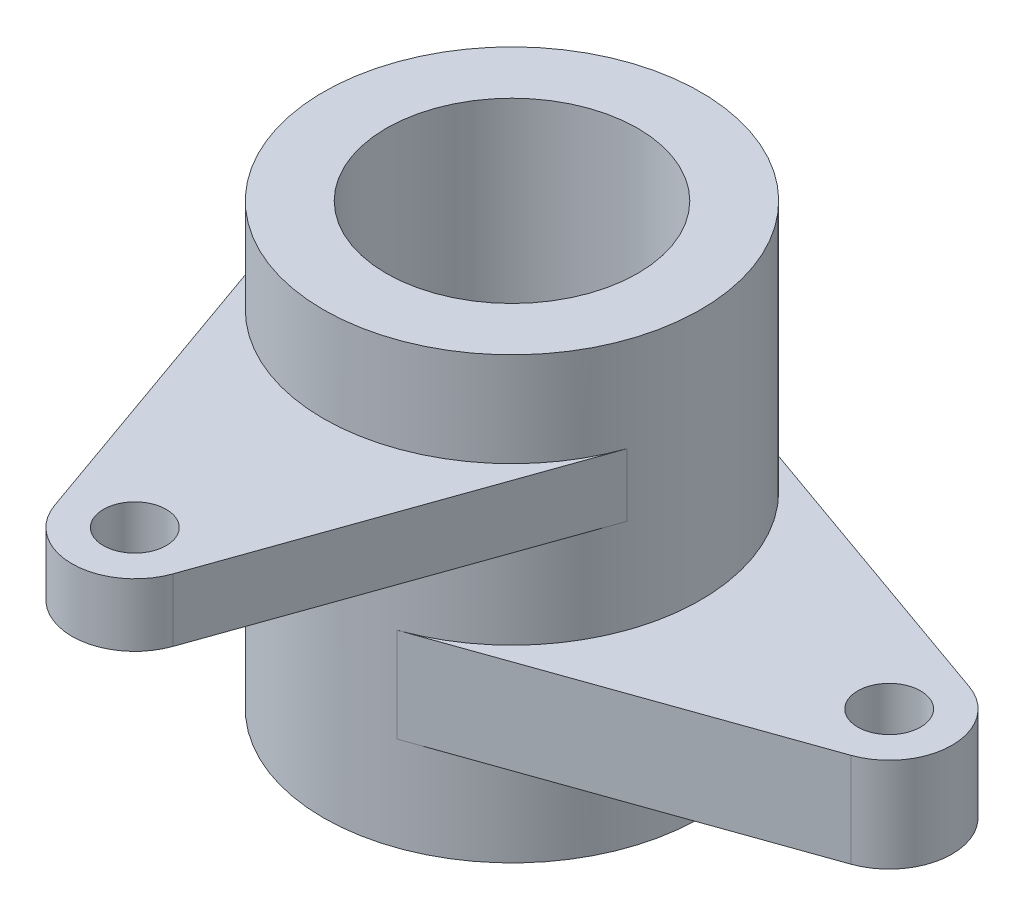
ISO-10303-21;
HEADER;
FILE_DESCRIPTION(('STEP AP214'),'2;1');
FILE_NAME('part.step','',(''),(''),'','','');
FILE_SCHEMA(('AUTOMOTIVE_DESIGN { 1 0 10303 214 1 1 1 1 }'));
ENDSEC;
DATA;
#1=APPLICATION_CONTEXT('core data for automotive mechanical design processes');
#2=APPLICATION_PROTOCOL_DEFINITION('international standard','automotive_design',2000,#1);
#3=PRODUCT_CONTEXT('',#1,'mechanical');
#4=PRODUCT('Part','Part','',(#3));
#5=PRODUCT_RELATED_PRODUCT_CATEGORY('part','',(#4));
#6=PRODUCT_DEFINITION_FORMATION('','',#4);
#7=PRODUCT_DEFINITION_CONTEXT('part definition',#1,'design');
#8=PRODUCT_DEFINITION('design','',#6,#7);
#9=PRODUCT_DEFINITION_SHAPE('','',#8);
#10=(LENGTH_UNIT() NAMED_UNIT(*) SI_UNIT(.MILLI.,.METRE.));
#11=(NAMED_UNIT(*) PLANE_ANGLE_UNIT() SI_UNIT($,.RADIAN.));
#12=(NAMED_UNIT(*) SI_UNIT($,.STERADIAN.) SOLID_ANGLE_UNIT());
#13=UNCERTAINTY_MEASURE_WITH_UNIT(LENGTH_MEASURE(1.E-05),#10,'distance_accuracy_value','');
#14=(GEOMETRIC_REPRESENTATION_CONTEXT(3) GLOBAL_UNCERTAINTY_ASSIGNED_CONTEXT((#13)) GLOBAL_UNIT_ASSIGNED_CONTEXT((#10,
#11,#12)) REPRESENTATION_CONTEXT('',''));
#15=CARTESIAN_POINT('',(0.,0.,0.));
#16=DIRECTION('',(0.,0.,1.));
#17=DIRECTION('',(1.,0.,0.));
#18=AXIS2_PLACEMENT_3D('',#15,#16,#17);
#19=CARTESIAN_POINT('',(10.0000000000001,-55.,28.2842712474619));
#20=DIRECTION('',(0.333333333333337,0.,0.942809041582062));
#21=DIRECTION('',(0.942809041582062,0.,-0.333333333333337));
#22=AXIS2_PLACEMENT_3D('',#19,#20,#21);
#23=PLANE('',#22);
#24=DIRECTION('',(0.942809041582062,0.,-0.333333333333337));
#25=VECTOR('',#24,1.);
#26=CARTESIAN_POINT('',(10.0000000000001,-40.,28.2842712474619));
#27=LINE('',#26,#25);
#28=CARTESIAN_POINT('',(10.0000000000001,-40.,28.2842712474619));
#29=VERTEX_POINT('',#28);
#30=CARTESIAN_POINT('',(63.3333333333333,-40.,9.42809041582041));
#31=VERTEX_POINT('',#30);
#32=EDGE_CURVE('E113',#29,#31,#27,.T.);
#33=ORIENTED_EDGE('',*,*,#32,.F.);
#34=DIRECTION('',(0.,1.,0.));
#35=VECTOR('',#34,1.);
#36=CARTESIAN_POINT('',(10.0000000000001,-55.,28.2842712474619));
#37=LINE('',#36,#35);
#38=CARTESIAN_POINT('',(10.0000000000001,-55.,28.2842712474619));
#39=VERTEX_POINT('',#38);
#40=EDGE_CURVE('E12',#39,#29,#37,.T.);
#41=ORIENTED_EDGE('',*,*,#40,.F.);
#42=DIRECTION('',(0.942809041582062,0.,-0.333333333333337));
#43=VECTOR('',#42,1.);
#44=CARTESIAN_POINT('',(10.0000000000001,-55.,28.2842712474619));
#45=LINE('',#44,#43);
#46=CARTESIAN_POINT('',(63.3333333333333,-55.,9.42809041582041));
#47=VERTEX_POINT('',#46);
#48=EDGE_CURVE('E103',#39,#47,#45,.T.);
#49=ORIENTED_EDGE('',*,*,#48,.T.);
#50=DIRECTION('',(0.,1.,0.));
#51=VECTOR('',#50,1.);
#52=CARTESIAN_POINT('',(63.3333333333333,-55.,9.42809041582041));
#53=LINE('',#52,#51);
#54=EDGE_CURVE('E47',#47,#31,#53,.T.);
#55=ORIENTED_EDGE('',*,*,#54,.T.);
#56=EDGE_LOOP('',(#33,#41,#49,#55));
#57=FACE_BOUND('',#56,.T.);
#58=ADVANCED_FACE('F43',(#57),#23,.T.);
#59=CARTESIAN_POINT('',(0.,-55.,0.));
#60=DIRECTION('',(0.,1.,0.));
#61=DIRECTION('',(1.,0.,0.));
#62=AXIS2_PLACEMENT_3D('',#59,#60,#61);
#63=CYLINDRICAL_SURFACE('',#62,30.);
#64=CARTESIAN_POINT('',(0.,-40.,0.));
#65=DIRECTION('',(0.,1.,0.));
#66=DIRECTION('',(1.,0.,0.));
#67=AXIS2_PLACEMENT_3D('',#64,#65,#66);
#68=CIRCLE('',#67,30.);
#69=CARTESIAN_POINT('',(9.9999999999999,-40.,-28.2842712474619));
#70=VERTEX_POINT('',#69);
#71=EDGE_CURVE('E119',#29,#70,#68,.T.);
#72=ORIENTED_EDGE('',*,*,#71,.T.);
#73=DIRECTION('',(0.,1.,0.));
#74=VECTOR('',#73,1.);
#75=CARTESIAN_POINT('',(9.9999999999999,-55.,-28.2842712474619));
#76=LINE('',#75,#74);
#77=CARTESIAN_POINT('',(9.9999999999999,-55.,-28.2842712474619));
#78=VERTEX_POINT('',#77);
#79=EDGE_CURVE('E53',#78,#70,#76,.T.);
#80=ORIENTED_EDGE('',*,*,#79,.F.);
#81=CARTESIAN_POINT('',(0.,-55.,0.));
#82=DIRECTION('',(0.,1.,0.));
#83=DIRECTION('',(1.,0.,0.));
#84=AXIS2_PLACEMENT_3D('',#81,#82,#83);
#85=CIRCLE('',#84,30.);
#86=EDGE_CURVE('E100',#39,#78,#85,.T.);
#87=ORIENTED_EDGE('',*,*,#86,.F.);
#88=ORIENTED_EDGE('',*,*,#40,.T.);
#89=EDGE_LOOP('',(#72,#80,#87,#88));
#90=FACE_BOUND('',#89,.T.);
#91=ADVANCED_FACE('F134',(#90),#63,.F.);
#92=CARTESIAN_POINT('',(9.9999999999999,-55.,-28.2842712474619));
#93=DIRECTION('',(0.33333333333333,0.,-0.942809041582065));
#94=DIRECTION('',(-0.942809041582065,0.,-0.33333333333333));
#95=AXIS2_PLACEMENT_3D('',#92,#93,#94);
#96=PLANE('',#95);
#97=DIRECTION('',(-0.942809041582065,0.,-0.33333333333333));
#98=VECTOR('',#97,1.);
#99=CARTESIAN_POINT('',(9.9999999999999,-40.,-28.2842712474619));
#100=LINE('',#99,#98);
#101=CARTESIAN_POINT('',(63.3333333333333,-40.,-9.42809041582086));
#102=VERTEX_POINT('',#101);
#103=EDGE_CURVE('E94',#102,#70,#100,.T.);
#104=ORIENTED_EDGE('',*,*,#103,.F.);
#105=DIRECTION('',(0.,1.,0.));
#106=VECTOR('',#105,1.);
#107=CARTESIAN_POINT('',(63.3333333333333,-55.,-9.42809041582086));
#108=LINE('',#107,#106);
#109=CARTESIAN_POINT('',(63.3333333333333,-55.,-9.42809041582086));
#110=VERTEX_POINT('',#109);
#111=EDGE_CURVE('E89',#110,#102,#108,.T.);
#112=ORIENTED_EDGE('',*,*,#111,.F.);
#113=DIRECTION('',(-0.942809041582065,0.,-0.33333333333333));
#114=VECTOR('',#113,1.);
#115=CARTESIAN_POINT('',(9.9999999999999,-55.,-28.2842712474619));
#116=LINE('',#115,#114);
#117=EDGE_CURVE('E92',#110,#78,#116,.T.);
#118=ORIENTED_EDGE('',*,*,#117,.T.);
#119=ORIENTED_EDGE('',*,*,#79,.T.);
#120=EDGE_LOOP('',(#104,#112,#118,#119));
#121=FACE_BOUND('',#120,.T.);
#122=ADVANCED_FACE('F91',(#121),#96,.T.);
#123=CARTESIAN_POINT('',(60.,-55.,-2.16836761125472E-13));
#124=DIRECTION('',(0.,1.,0.));
#125=DIRECTION('',(1.,0.,0.));
#126=AXIS2_PLACEMENT_3D('',#123,#124,#125);
#127=CYLINDRICAL_SURFACE('',#126,5.);
#128=CARTESIAN_POINT('',(60.,-55.,-2.16836761125472E-13));
#129=DIRECTION('',(0.,1.,0.));
#130=DIRECTION('',(1.,0.,0.));
#131=AXIS2_PLACEMENT_3D('',#128,#129,#130);
#132=CIRCLE('',#131,5.);
#133=CARTESIAN_POINT('',(65.,-55.,-2.34294167819688E-13));
#134=VERTEX_POINT('',#133);
#135=EDGE_CURVE('E105',#134,#134,#132,.T.);
#136=ORIENTED_EDGE('',*,*,#135,.F.);
#137=EDGE_LOOP('',(#136));
#138=FACE_BOUND('',#137,.T.);
#139=CARTESIAN_POINT('',(60.,-40.,-2.16836761125472E-13));
#140=DIRECTION('',(0.,1.,0.));
#141=DIRECTION('',(1.,0.,0.));
#142=AXIS2_PLACEMENT_3D('',#139,#140,#141);
#143=CIRCLE('',#142,5.);
#144=CARTESIAN_POINT('',(65.,-40.,-2.34294167819688E-13));
#145=VERTEX_POINT('',#144);
#146=EDGE_CURVE('E110',#145,#145,#143,.T.);
#147=ORIENTED_EDGE('',*,*,#146,.T.);
#148=EDGE_LOOP('',(#147));
#149=FACE_BOUND('',#148,.T.);
#150=ADVANCED_FACE('F45',(#138,#149),#127,.F.);
#151=CARTESIAN_POINT('',(60.,-55.,-2.16836761125472E-13));
#152=DIRECTION('',(0.,1.,0.));
#153=DIRECTION('',(1.,0.,0.));
#154=AXIS2_PLACEMENT_3D('',#151,#152,#153);
#155=CYLINDRICAL_SURFACE('',#154,10.);
#156=CARTESIAN_POINT('',(60.,-40.,-2.16836761125472E-13));
#157=DIRECTION('',(0.,1.,0.));
#158=DIRECTION('',(1.,0.,0.));
#159=AXIS2_PLACEMENT_3D('',#156,#157,#158);
#160=CIRCLE('',#159,10.);
#161=EDGE_CURVE('E116',#31,#102,#160,.T.);
#162=ORIENTED_EDGE('',*,*,#161,.F.);
#163=ORIENTED_EDGE('',*,*,#54,.F.);
#164=CARTESIAN_POINT('',(60.,-55.,-2.16836761125472E-13));
#165=DIRECTION('',(0.,1.,0.));
#166=DIRECTION('',(1.,0.,0.));
#167=AXIS2_PLACEMENT_3D('',#164,#165,#166);
#168=CIRCLE('',#167,10.);
#169=EDGE_CURVE('E99',#47,#110,#168,.T.);
#170=ORIENTED_EDGE('',*,*,#169,.T.);
#171=ORIENTED_EDGE('',*,*,#111,.T.);
#172=EDGE_LOOP('',(#162,#163,#170,#171));
#173=FACE_BOUND('',#172,.T.);
#174=ADVANCED_FACE('F102',(#173),#155,.T.);
#175=CARTESIAN_POINT('',(0.,-55.,0.));
#176=DIRECTION('',(0.,1.,0.));
#177=DIRECTION('',(1.,0.,0.));
#178=AXIS2_PLACEMENT_3D('',#175,#176,#177);
#179=PLANE('',#178);
#180=ORIENTED_EDGE('',*,*,#135,.T.);
#181=EDGE_LOOP('',(#180));
#182=FACE_BOUND('',#181,.T.);
#183=ORIENTED_EDGE('',*,*,#48,.F.);
#184=ORIENTED_EDGE('',*,*,#86,.T.);
#185=ORIENTED_EDGE('',*,*,#117,.F.);
#186=ORIENTED_EDGE('',*,*,#169,.F.);
#187=EDGE_LOOP('',(#183,#184,#185,#186));
#188=FACE_BOUND('',#187,.T.);
#189=ADVANCED_FACE('F98',(#182,#188),#179,.F.);
#190=CARTESIAN_POINT('',(0.,-40.,0.));
#191=DIRECTION('',(0.,1.,0.));
#192=DIRECTION('',(1.,0.,0.));
#193=AXIS2_PLACEMENT_3D('',#190,#191,#192);
#194=PLANE('',#193);
#195=ORIENTED_EDGE('',*,*,#146,.F.);
#196=EDGE_LOOP('',(#195));
#197=FACE_BOUND('',#196,.T.);
#198=ORIENTED_EDGE('',*,*,#32,.T.);
#199=ORIENTED_EDGE('',*,*,#161,.T.);
#200=ORIENTED_EDGE('',*,*,#103,.T.);
#201=ORIENTED_EDGE('',*,*,#71,.F.);
#202=EDGE_LOOP('',(#198,#199,#200,#201));
#203=FACE_BOUND('',#202,.T.);
#204=ADVANCED_FACE('F129',(#197,#203),#194,.T.);
#205=CLOSED_SHELL('',(#58,#91,#122,#150,#174,#189,#204));
#206=MANIFOLD_SOLID_BREP('B2',#205);
#207=CARTESIAN_POINT('',(0.,-70.,0.));
#208=DIRECTION('',(0.,1.,0.));
#209=DIRECTION('',(0.,0.,1.));
#210=AXIS2_PLACEMENT_3D('',#207,#208,#209);
#211=CYLINDRICAL_SURFACE('',#210,30.);
#212=CARTESIAN_POINT('',(0.,-70.,0.));
#213=DIRECTION('',(0.,1.,0.));
#214=DIRECTION('',(0.,0.,1.));
#215=AXIS2_PLACEMENT_3D('',#212,#213,#214);
#216=CIRCLE('',#215,30.);
#217=CARTESIAN_POINT('',(0.,-70.,30.));
#218=VERTEX_POINT('',#217);
#219=EDGE_CURVE('E41',#218,#218,#216,.T.);
#220=ORIENTED_EDGE('',*,*,#219,.T.);
#221=EDGE_LOOP('',(#220));
#222=FACE_BOUND('',#221,.T.);
#223=CARTESIAN_POINT('',(0.,0.,0.));
#224=DIRECTION('',(0.,1.,0.));
#225=DIRECTION('',(0.,0.,1.));
#226=AXIS2_PLACEMENT_3D('',#223,#224,#225);
#227=CIRCLE('',#226,30.);
#228=CARTESIAN_POINT('',(0.,0.,30.));
#229=VERTEX_POINT('',#228);
#230=EDGE_CURVE('E194',#229,#229,#227,.T.);
#231=ORIENTED_EDGE('',*,*,#230,.F.);
#232=EDGE_LOOP('',(#231));
#233=FACE_BOUND('',#232,.T.);
#234=DIRECTION('',(0.,1.,0.));
#235=VECTOR('',#234,1.);
#236=CARTESIAN_POINT('',(28.2842712474619,-25.,10.));
#237=LINE('',#236,#235);
#238=CARTESIAN_POINT('',(28.2842712474619,-25.,10.));
#239=VERTEX_POINT('',#238);
#240=CARTESIAN_POINT('',(28.2842712474619,-15.,10.));
#241=VERTEX_POINT('',#240);
#242=EDGE_CURVE('E210',#239,#241,#237,.T.);
#243=ORIENTED_EDGE('',*,*,#242,.F.);
#244=CARTESIAN_POINT('',(0.,-25.,0.));
#245=DIRECTION('',(0.,1.,0.));
#246=DIRECTION('',(0.,0.,1.));
#247=AXIS2_PLACEMENT_3D('',#244,#245,#246);
#248=CIRCLE('',#247,30.);
#249=CARTESIAN_POINT('',(-28.2842712474619,-25.,10.));
#250=VERTEX_POINT('',#249);
#251=EDGE_CURVE('E205',#250,#239,#248,.T.);
#252=ORIENTED_EDGE('',*,*,#251,.F.);
#253=DIRECTION('',(0.,1.,0.));
#254=VECTOR('',#253,1.);
#255=CARTESIAN_POINT('',(-28.2842712474619,-25.,10.));
#256=LINE('',#255,#254);
#257=CARTESIAN_POINT('',(-28.2842712474619,-15.,10.));
#258=VERTEX_POINT('',#257);
#259=EDGE_CURVE('E250',#250,#258,#256,.T.);
#260=ORIENTED_EDGE('',*,*,#259,.T.);
#261=CARTESIAN_POINT('',(0.,-15.,0.));
#262=DIRECTION('',(0.,1.,0.));
#263=DIRECTION('',(0.,0.,1.));
#264=AXIS2_PLACEMENT_3D('',#261,#262,#263);
#265=CIRCLE('',#264,30.);
#266=EDGE_CURVE('E254',#258,#241,#265,.T.);
#267=ORIENTED_EDGE('',*,*,#266,.T.);
#268=EDGE_LOOP('',(#243,#252,#260,#267));
#269=FACE_BOUND('',#268,.T.);
#270=ADVANCED_FACE('F191',(#222,#233,#269),#211,.T.);
#271=CARTESIAN_POINT('',(0.,-70.,0.));
#272=DIRECTION('',(0.,1.,0.));
#273=DIRECTION('',(0.,0.,1.));
#274=AXIS2_PLACEMENT_3D('',#271,#272,#273);
#275=PLANE('',#274);
#276=CARTESIAN_POINT('',(0.,-70.,0.));
#277=DIRECTION('',(0.,1.,0.));
#278=DIRECTION('',(0.,0.,1.));
#279=AXIS2_PLACEMENT_3D('',#276,#277,#278);
#280=CIRCLE('',#279,20.);
#281=CARTESIAN_POINT('',(0.,-70.,20.));
#282=VERTEX_POINT('',#281);
#283=EDGE_CURVE('E273',#282,#282,#280,.T.);
#284=ORIENTED_EDGE('',*,*,#283,.T.);
#285=EDGE_LOOP('',(#284));
#286=FACE_BOUND('',#285,.T.);
#287=ORIENTED_EDGE('',*,*,#219,.F.);
#288=EDGE_LOOP('',(#287));
#289=FACE_BOUND('',#288,.T.);
#290=ADVANCED_FACE('F284',(#286,#289),#275,.F.);
#291=CARTESIAN_POINT('',(0.,0.,0.));
#292=DIRECTION('',(0.,1.,0.));
#293=DIRECTION('',(0.,0.,1.));
#294=AXIS2_PLACEMENT_3D('',#291,#292,#293);
#295=PLANE('',#294);
#296=CARTESIAN_POINT('',(0.,0.,0.));
#297=DIRECTION('',(0.,1.,0.));
#298=DIRECTION('',(0.,0.,1.));
#299=AXIS2_PLACEMENT_3D('',#296,#297,#298);
#300=CIRCLE('',#299,20.);
#301=CARTESIAN_POINT('',(0.,0.,20.));
#302=VERTEX_POINT('',#301);
#303=EDGE_CURVE('E270',#302,#302,#300,.T.);
#304=ORIENTED_EDGE('',*,*,#303,.F.);
#305=EDGE_LOOP('',(#304));
#306=FACE_BOUND('',#305,.T.);
#307=ORIENTED_EDGE('',*,*,#230,.T.);
#308=EDGE_LOOP('',(#307));
#309=FACE_BOUND('',#308,.T.);
#310=ADVANCED_FACE('F281',(#306,#309),#295,.T.);
#311=CARTESIAN_POINT('',(0.,-70.,0.));
#312=DIRECTION('',(0.,1.,0.));
#313=DIRECTION('',(0.,0.,1.));
#314=AXIS2_PLACEMENT_3D('',#311,#312,#313);
#315=CYLINDRICAL_SURFACE('',#314,20.);
#316=ORIENTED_EDGE('',*,*,#283,.F.);
#317=EDGE_LOOP('',(#316));
#318=FACE_BOUND('',#317,.T.);
#319=ORIENTED_EDGE('',*,*,#303,.T.);
#320=EDGE_LOOP('',(#319));
#321=FACE_BOUND('',#320,.T.);
#322=ADVANCED_FACE('F279',(#318,#321),#315,.F.);
#323=CARTESIAN_POINT('',(-28.2842712474619,-25.,10.));
#324=DIRECTION('',(-0.942809041582063,0.,0.333333333333334));
#325=DIRECTION('',(0.333333333333334,0.,0.942809041582063));
#326=AXIS2_PLACEMENT_3D('',#323,#324,#325);
#327=PLANE('',#326);
#328=DIRECTION('',(0.333333333333334,0.,0.942809041582063));
#329=VECTOR('',#328,1.);
#330=CARTESIAN_POINT('',(-28.2842712474619,-15.,10.));
#331=LINE('',#330,#329);
#332=CARTESIAN_POINT('',(-9.42809041582063,-15.,63.3333333333333));
#333=VERTEX_POINT('',#332);
#334=EDGE_CURVE('E262',#258,#333,#331,.T.);
#335=ORIENTED_EDGE('',*,*,#334,.F.);
#336=ORIENTED_EDGE('',*,*,#259,.F.);
#337=DIRECTION('',(0.333333333333334,0.,0.942809041582063));
#338=VECTOR('',#337,1.);
#339=CARTESIAN_POINT('',(-28.2842712474619,-25.,10.));
#340=LINE('',#339,#338);
#341=CARTESIAN_POINT('',(-9.42809041582063,-25.,63.3333333333333));
#342=VERTEX_POINT('',#341);
#343=EDGE_CURVE('E245',#250,#342,#340,.T.);
#344=ORIENTED_EDGE('',*,*,#343,.T.);
#345=DIRECTION('',(0.,1.,0.));
#346=VECTOR('',#345,1.);
#347=CARTESIAN_POINT('',(-9.42809041582063,-25.,63.3333333333333));
#348=LINE('',#347,#346);
#349=EDGE_CURVE('E229',#342,#333,#348,.T.);
#350=ORIENTED_EDGE('',*,*,#349,.T.);
#351=EDGE_LOOP('',(#335,#336,#344,#350));
#352=FACE_BOUND('',#351,.T.);
#353=ADVANCED_FACE('F249',(#352),#327,.T.);
#354=CARTESIAN_POINT('',(28.2842712474619,-25.,10.));
#355=DIRECTION('',(0.942809041582063,0.,0.333333333333333));
#356=DIRECTION('',(0.333333333333333,0.,-0.942809041582063));
#357=AXIS2_PLACEMENT_3D('',#354,#355,#356);
#358=PLANE('',#357);
#359=DIRECTION('',(0.333333333333333,0.,-0.942809041582063));
#360=VECTOR('',#359,1.);
#361=CARTESIAN_POINT('',(28.2842712474619,-15.,10.));
#362=LINE('',#361,#360);
#363=CARTESIAN_POINT('',(9.42809041582064,-15.,63.3333333333333));
#364=VERTEX_POINT('',#363);
#365=EDGE_CURVE('E265',#364,#241,#362,.T.);
#366=ORIENTED_EDGE('',*,*,#365,.F.);
#367=DIRECTION('',(0.,1.,0.));
#368=VECTOR('',#367,1.);
#369=CARTESIAN_POINT('',(9.42809041582064,-25.,63.3333333333333));
#370=LINE('',#369,#368);
#371=CARTESIAN_POINT('',(9.42809041582064,-25.,63.3333333333333));
#372=VERTEX_POINT('',#371);
#373=EDGE_CURVE('E239',#372,#364,#370,.T.);
#374=ORIENTED_EDGE('',*,*,#373,.F.);
#375=DIRECTION('',(0.333333333333333,0.,-0.942809041582063));
#376=VECTOR('',#375,1.);
#377=CARTESIAN_POINT('',(28.2842712474619,-25.,10.));
#378=LINE('',#377,#376);
#379=EDGE_CURVE('E247',#372,#239,#378,.T.);
#380=ORIENTED_EDGE('',*,*,#379,.T.);
#381=ORIENTED_EDGE('',*,*,#242,.T.);
#382=EDGE_LOOP('',(#366,#374,#380,#381));
#383=FACE_BOUND('',#382,.T.);
#384=ADVANCED_FACE('F306',(#383),#358,.T.);
#385=CARTESIAN_POINT('',(0.,-25.,60.));
#386=DIRECTION('',(0.,1.,0.));
#387=DIRECTION('',(0.,0.,1.));
#388=AXIS2_PLACEMENT_3D('',#385,#386,#387);
#389=CYLINDRICAL_SURFACE('',#388,5.);
#390=CARTESIAN_POINT('',(0.,-25.,60.));
#391=DIRECTION('',(0.,1.,0.));
#392=DIRECTION('',(0.,0.,1.));
#393=AXIS2_PLACEMENT_3D('',#390,#391,#392);
#394=CIRCLE('',#393,5.);
#395=CARTESIAN_POINT('',(0.,-25.,65.));
#396=VERTEX_POINT('',#395);
#397=EDGE_CURVE('E251',#396,#396,#394,.T.);
#398=ORIENTED_EDGE('',*,*,#397,.F.);
#399=EDGE_LOOP('',(#398));
#400=FACE_BOUND('',#399,.T.);
#401=CARTESIAN_POINT('',(0.,-15.,60.));
#402=DIRECTION('',(0.,1.,0.));
#403=DIRECTION('',(0.,0.,1.));
#404=AXIS2_PLACEMENT_3D('',#401,#402,#403);
#405=CIRCLE('',#404,5.);
#406=CARTESIAN_POINT('',(0.,-15.,65.));
#407=VERTEX_POINT('',#406);
#408=EDGE_CURVE('E259',#407,#407,#405,.T.);
#409=ORIENTED_EDGE('',*,*,#408,.T.);
#410=EDGE_LOOP('',(#409));
#411=FACE_BOUND('',#410,.T.);
#412=ADVANCED_FACE('F303',(#400,#411),#389,.F.);
#413=CARTESIAN_POINT('',(0.,-25.,60.));
#414=DIRECTION('',(0.,1.,0.));
#415=DIRECTION('',(0.,0.,1.));
#416=AXIS2_PLACEMENT_3D('',#413,#414,#415);
#417=CYLINDRICAL_SURFACE('',#416,10.);
#418=CARTESIAN_POINT('',(0.,-15.,60.));
#419=DIRECTION('',(0.,1.,0.));
#420=DIRECTION('',(0.,0.,1.));
#421=AXIS2_PLACEMENT_3D('',#418,#419,#420);
#422=CIRCLE('',#421,10.);
#423=EDGE_CURVE('E234',#333,#364,#422,.T.);
#424=ORIENTED_EDGE('',*,*,#423,.F.);
#425=ORIENTED_EDGE('',*,*,#349,.F.);
#426=CARTESIAN_POINT('',(0.,-25.,60.));
#427=DIRECTION('',(0.,1.,0.));
#428=DIRECTION('',(0.,0.,1.));
#429=AXIS2_PLACEMENT_3D('',#426,#427,#428);
#430=CIRCLE('',#429,10.);
#431=EDGE_CURVE('E232',#342,#372,#430,.T.);
#432=ORIENTED_EDGE('',*,*,#431,.T.);
#433=ORIENTED_EDGE('',*,*,#373,.T.);
#434=EDGE_LOOP('',(#424,#425,#432,#433));
#435=FACE_BOUND('',#434,.T.);
#436=ADVANCED_FACE('F231',(#435),#417,.T.);
#437=CARTESIAN_POINT('',(0.,-25.,0.));
#438=DIRECTION('',(0.,1.,0.));
#439=DIRECTION('',(0.,0.,1.));
#440=AXIS2_PLACEMENT_3D('',#437,#438,#439);
#441=PLANE('',#440);
#442=ORIENTED_EDGE('',*,*,#397,.T.);
#443=EDGE_LOOP('',(#442));
#444=FACE_BOUND('',#443,.T.);
#445=ORIENTED_EDGE('',*,*,#343,.F.);
#446=ORIENTED_EDGE('',*,*,#251,.T.);
#447=ORIENTED_EDGE('',*,*,#379,.F.);
#448=ORIENTED_EDGE('',*,*,#431,.F.);
#449=EDGE_LOOP('',(#445,#446,#447,#448));
#450=FACE_BOUND('',#449,.T.);
#451=ADVANCED_FACE('F244',(#444,#450),#441,.F.);
#452=CARTESIAN_POINT('',(0.,-15.,0.));
#453=DIRECTION('',(0.,1.,0.));
#454=DIRECTION('',(0.,0.,1.));
#455=AXIS2_PLACEMENT_3D('',#452,#453,#454);
#456=PLANE('',#455);
#457=ORIENTED_EDGE('',*,*,#408,.F.);
#458=EDGE_LOOP('',(#457));
#459=FACE_BOUND('',#458,.T.);
#460=ORIENTED_EDGE('',*,*,#334,.T.);
#461=ORIENTED_EDGE('',*,*,#423,.T.);
#462=ORIENTED_EDGE('',*,*,#365,.T.);
#463=ORIENTED_EDGE('',*,*,#266,.F.);
#464=EDGE_LOOP('',(#460,#461,#462,#463));
#465=FACE_BOUND('',#464,.T.);
#466=ADVANCED_FACE('F315',(#459,#465),#456,.T.);
#467=CLOSED_SHELL('',(#270,#290,#310,#322,#353,#384,#412,#436,#451,#466));
#468=MANIFOLD_SOLID_BREP('B6',#467);
#469=ADVANCED_BREP_SHAPE_REPRESENTATION('',(#18,#206,#468),#14);
#470=SHAPE_DEFINITION_REPRESENTATION(#9,#469);
ENDSEC;
END-ISO-10303-21;
